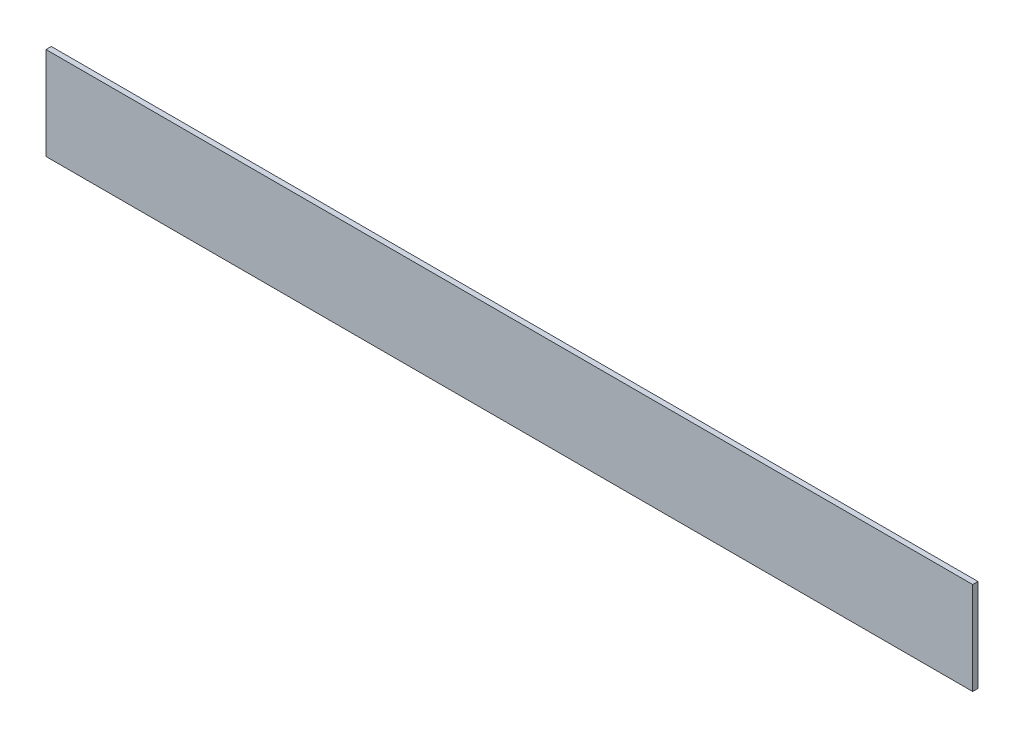
ISO-10303-21;
HEADER;
FILE_DESCRIPTION(('STEP AP214'),'2;1');
FILE_NAME('part.step','',(''),(''),'','','');
FILE_SCHEMA(('AUTOMOTIVE_DESIGN { 1 0 10303 214 1 1 1 1 }'));
ENDSEC;
DATA;
#1=APPLICATION_CONTEXT('core data for automotive mechanical design processes');
#2=APPLICATION_PROTOCOL_DEFINITION('international standard','automotive_design',2000,#1);
#3=PRODUCT_CONTEXT('',#1,'mechanical');
#4=PRODUCT('Part','Part','',(#3));
#5=PRODUCT_RELATED_PRODUCT_CATEGORY('part','',(#4));
#6=PRODUCT_DEFINITION_FORMATION('','',#4);
#7=PRODUCT_DEFINITION_CONTEXT('part definition',#1,'design');
#8=PRODUCT_DEFINITION('design','',#6,#7);
#9=PRODUCT_DEFINITION_SHAPE('','',#8);
#10=(LENGTH_UNIT() NAMED_UNIT(*) SI_UNIT(.MILLI.,.METRE.));
#11=(NAMED_UNIT(*) PLANE_ANGLE_UNIT() SI_UNIT($,.RADIAN.));
#12=(NAMED_UNIT(*) SI_UNIT($,.STERADIAN.) SOLID_ANGLE_UNIT());
#13=UNCERTAINTY_MEASURE_WITH_UNIT(LENGTH_MEASURE(1.E-05),#10,'distance_accuracy_value','');
#14=(GEOMETRIC_REPRESENTATION_CONTEXT(3) GLOBAL_UNCERTAINTY_ASSIGNED_CONTEXT((#13)) GLOBAL_UNIT_ASSIGNED_CONTEXT((#10,
#11,#12)) REPRESENTATION_CONTEXT('',''));
#15=CARTESIAN_POINT('',(0.,0.,0.));
#16=DIRECTION('',(0.,0.,1.));
#17=DIRECTION('',(1.,0.,0.));
#18=AXIS2_PLACEMENT_3D('',#15,#16,#17);
#19=CARTESIAN_POINT('',(-211.275414463158,35.,-23.0000000000001));
#20=DIRECTION('',(0.,0.,-1.));
#21=DIRECTION('',(-1.,0.,0.));
#22=AXIS2_PLACEMENT_3D('',#19,#20,#21);
#23=PLANE('',#22);
#24=DIRECTION('',(1.,0.,0.));
#25=VECTOR('',#24,1.);
#26=CARTESIAN_POINT('',(-211.275414463158,0.,-23.0000000000001));
#27=LINE('',#26,#25);
#28=CARTESIAN_POINT('',(-211.275414463158,0.,-23.0000000000001));
#29=VERTEX_POINT('',#28);
#30=CARTESIAN_POINT('',(138.724585536842,0.,-23.0000000000001));
#31=VERTEX_POINT('',#30);
#32=EDGE_CURVE('E98',#29,#31,#27,.T.);
#33=ORIENTED_EDGE('',*,*,#32,.T.);
#34=DIRECTION('',(0.,-1.,0.));
#35=VECTOR('',#34,1.);
#36=CARTESIAN_POINT('',(138.724585536842,35.,-23.0000000000001));
#37=LINE('',#36,#35);
#38=CARTESIAN_POINT('',(138.724585536842,35.,-23.0000000000001));
#39=VERTEX_POINT('',#38);
#40=EDGE_CURVE('E11',#39,#31,#37,.T.);
#41=ORIENTED_EDGE('',*,*,#40,.F.);
#42=DIRECTION('',(1.,0.,0.));
#43=VECTOR('',#42,1.);
#44=CARTESIAN_POINT('',(-211.275414463158,35.,-23.0000000000001));
#45=LINE('',#44,#43);
#46=CARTESIAN_POINT('',(-211.275414463158,35.,-23.0000000000001));
#47=VERTEX_POINT('',#46);
#48=EDGE_CURVE('E86',#47,#39,#45,.T.);
#49=ORIENTED_EDGE('',*,*,#48,.F.);
#50=DIRECTION('',(0.,-1.,0.));
#51=VECTOR('',#50,1.);
#52=CARTESIAN_POINT('',(-211.275414463158,35.,-23.0000000000001));
#53=LINE('',#52,#51);
#54=EDGE_CURVE('E94',#47,#29,#53,.T.);
#55=ORIENTED_EDGE('',*,*,#54,.T.);
#56=EDGE_LOOP('',(#33,#41,#49,#55));
#57=FACE_BOUND('',#56,.T.);
#58=ADVANCED_FACE('F35',(#57),#23,.F.);
#59=CARTESIAN_POINT('',(138.724585536842,35.,-23.0000000000001));
#60=DIRECTION('',(-1.,0.,0.));
#61=DIRECTION('',(0.,0.,1.));
#62=AXIS2_PLACEMENT_3D('',#59,#60,#61);
#63=PLANE('',#62);
#64=DIRECTION('',(0.,0.,-1.));
#65=VECTOR('',#64,1.);
#66=CARTESIAN_POINT('',(138.724585536842,0.,-23.0000000000001));
#67=LINE('',#66,#65);
#68=CARTESIAN_POINT('',(138.724585536842,0.,-25.0000000000001));
#69=VERTEX_POINT('',#68);
#70=EDGE_CURVE('E90',#31,#69,#67,.T.);
#71=ORIENTED_EDGE('',*,*,#70,.T.);
#72=DIRECTION('',(0.,-1.,0.));
#73=VECTOR('',#72,1.);
#74=CARTESIAN_POINT('',(138.724585536842,35.,-25.0000000000001));
#75=LINE('',#74,#73);
#76=CARTESIAN_POINT('',(138.724585536842,35.,-25.0000000000001));
#77=VERTEX_POINT('',#76);
#78=EDGE_CURVE('E43',#77,#69,#75,.T.);
#79=ORIENTED_EDGE('',*,*,#78,.F.);
#80=DIRECTION('',(0.,0.,-1.));
#81=VECTOR('',#80,1.);
#82=CARTESIAN_POINT('',(138.724585536842,35.,-23.0000000000001));
#83=LINE('',#82,#81);
#84=EDGE_CURVE('E81',#39,#77,#83,.T.);
#85=ORIENTED_EDGE('',*,*,#84,.F.);
#86=ORIENTED_EDGE('',*,*,#40,.T.);
#87=EDGE_LOOP('',(#71,#79,#85,#86));
#88=FACE_BOUND('',#87,.T.);
#89=ADVANCED_FACE('F89',(#88),#63,.F.);
#90=CARTESIAN_POINT('',(-211.275414463158,35.,-25.0000000000001));
#91=DIRECTION('',(0.,0.,1.));
#92=DIRECTION('',(1.,0.,0.));
#93=AXIS2_PLACEMENT_3D('',#90,#91,#92);
#94=PLANE('',#93);
#95=DIRECTION('',(-1.,0.,0.));
#96=VECTOR('',#95,1.);
#97=CARTESIAN_POINT('',(-211.275414463158,0.,-25.0000000000001));
#98=LINE('',#97,#96);
#99=CARTESIAN_POINT('',(-211.275414463158,0.,-25.0000000000001));
#100=VERTEX_POINT('',#99);
#101=EDGE_CURVE('E68',#69,#100,#98,.T.);
#102=ORIENTED_EDGE('',*,*,#101,.T.);
#103=DIRECTION('',(0.,-1.,0.));
#104=VECTOR('',#103,1.);
#105=CARTESIAN_POINT('',(-211.275414463158,35.,-25.0000000000001));
#106=LINE('',#105,#104);
#107=CARTESIAN_POINT('',(-211.275414463158,35.,-25.0000000000001));
#108=VERTEX_POINT('',#107);
#109=EDGE_CURVE('E91',#108,#100,#106,.T.);
#110=ORIENTED_EDGE('',*,*,#109,.F.);
#111=DIRECTION('',(-1.,0.,0.));
#112=VECTOR('',#111,1.);
#113=CARTESIAN_POINT('',(-211.275414463158,35.,-25.0000000000001));
#114=LINE('',#113,#112);
#115=EDGE_CURVE('E84',#77,#108,#114,.T.);
#116=ORIENTED_EDGE('',*,*,#115,.F.);
#117=ORIENTED_EDGE('',*,*,#78,.T.);
#118=EDGE_LOOP('',(#102,#110,#116,#117));
#119=FACE_BOUND('',#118,.T.);
#120=ADVANCED_FACE('F92',(#119),#94,.F.);
#121=CARTESIAN_POINT('',(-211.275414463158,35.,-25.0000000000001));
#122=DIRECTION('',(1.,0.,0.));
#123=DIRECTION('',(0.,0.,-1.));
#124=AXIS2_PLACEMENT_3D('',#121,#122,#123);
#125=PLANE('',#124);
#126=DIRECTION('',(0.,0.,1.));
#127=VECTOR('',#126,1.);
#128=CARTESIAN_POINT('',(-211.275414463158,0.,-25.0000000000001));
#129=LINE('',#128,#127);
#130=EDGE_CURVE('E74',#100,#29,#129,.T.);
#131=ORIENTED_EDGE('',*,*,#130,.T.);
#132=ORIENTED_EDGE('',*,*,#54,.F.);
#133=DIRECTION('',(0.,0.,1.));
#134=VECTOR('',#133,1.);
#135=CARTESIAN_POINT('',(-211.275414463158,35.,-25.0000000000001));
#136=LINE('',#135,#134);
#137=EDGE_CURVE('E51',#108,#47,#136,.T.);
#138=ORIENTED_EDGE('',*,*,#137,.F.);
#139=ORIENTED_EDGE('',*,*,#109,.T.);
#140=EDGE_LOOP('',(#131,#132,#138,#139));
#141=FACE_BOUND('',#140,.T.);
#142=ADVANCED_FACE('F105',(#141),#125,.F.);
#143=CARTESIAN_POINT('',(0.,35.,0.));
#144=DIRECTION('',(0.,1.,0.));
#145=DIRECTION('',(0.,0.,1.));
#146=AXIS2_PLACEMENT_3D('',#143,#144,#145);
#147=PLANE('',#146);
#148=ORIENTED_EDGE('',*,*,#48,.T.);
#149=ORIENTED_EDGE('',*,*,#84,.T.);
#150=ORIENTED_EDGE('',*,*,#115,.T.);
#151=ORIENTED_EDGE('',*,*,#137,.T.);
#152=EDGE_LOOP('',(#148,#149,#150,#151));
#153=FACE_BOUND('',#152,.T.);
#154=ADVANCED_FACE('F82',(#153),#147,.T.);
#155=CARTESIAN_POINT('',(0.,0.,0.));
#156=DIRECTION('',(0.,1.,0.));
#157=DIRECTION('',(0.,0.,1.));
#158=AXIS2_PLACEMENT_3D('',#155,#156,#157);
#159=PLANE('',#158);
#160=ORIENTED_EDGE('',*,*,#32,.F.);
#161=ORIENTED_EDGE('',*,*,#130,.F.);
#162=ORIENTED_EDGE('',*,*,#101,.F.);
#163=ORIENTED_EDGE('',*,*,#70,.F.);
#164=EDGE_LOOP('',(#160,#161,#162,#163));
#165=FACE_BOUND('',#164,.T.);
#166=ADVANCED_FACE('F108',(#165),#159,.F.);
#167=CLOSED_SHELL('',(#58,#89,#120,#142,#154,#166));
#168=MANIFOLD_SOLID_BREP('B2',#167);
#169=ADVANCED_BREP_SHAPE_REPRESENTATION('',(#18,#168),#14);
#170=SHAPE_DEFINITION_REPRESENTATION(#9,#169);
ENDSEC;
END-ISO-10303-21;
